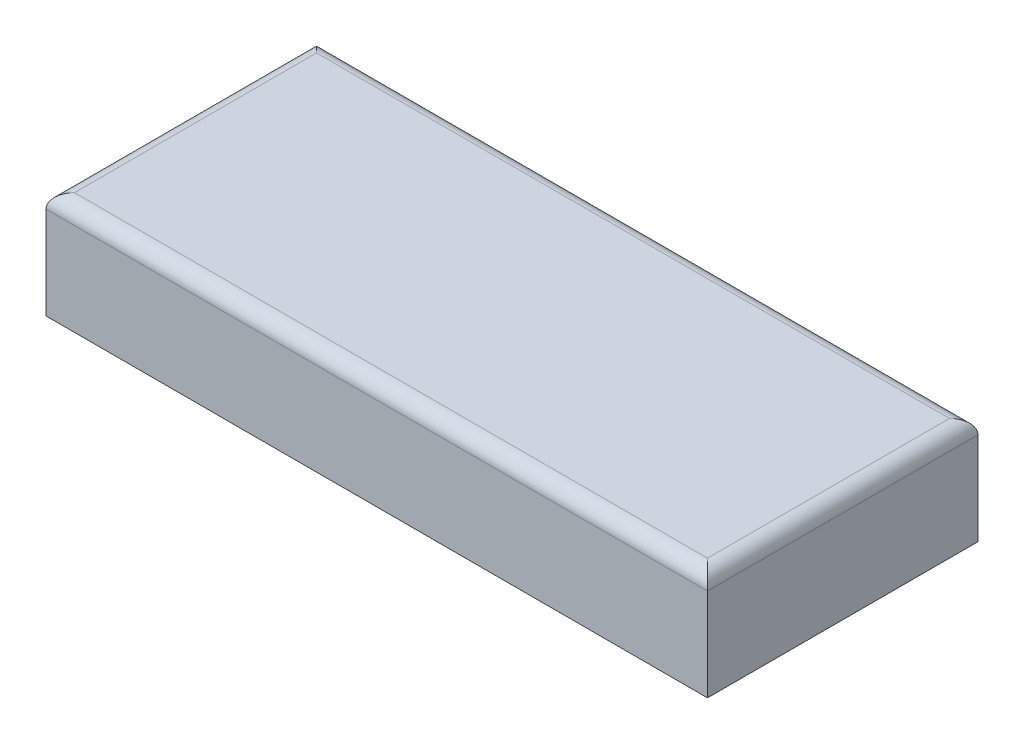
ISO-10303-21;
HEADER;
FILE_DESCRIPTION(('STEP AP214'),'2;1');
FILE_NAME('part.step','',(''),(''),'','','');
FILE_SCHEMA(('AUTOMOTIVE_DESIGN { 1 0 10303 214 1 1 1 1 }'));
ENDSEC;
DATA;
#1=APPLICATION_CONTEXT('core data for automotive mechanical design processes');
#2=APPLICATION_PROTOCOL_DEFINITION('international standard','automotive_design',2000,#1);
#3=PRODUCT_CONTEXT('',#1,'mechanical');
#4=PRODUCT('Part','Part','',(#3));
#5=PRODUCT_RELATED_PRODUCT_CATEGORY('part','',(#4));
#6=PRODUCT_DEFINITION_FORMATION('','',#4);
#7=PRODUCT_DEFINITION_CONTEXT('part definition',#1,'design');
#8=PRODUCT_DEFINITION('design','',#6,#7);
#9=PRODUCT_DEFINITION_SHAPE('','',#8);
#10=(LENGTH_UNIT() NAMED_UNIT(*) SI_UNIT(.MILLI.,.METRE.));
#11=(NAMED_UNIT(*) PLANE_ANGLE_UNIT() SI_UNIT($,.RADIAN.));
#12=(NAMED_UNIT(*) SI_UNIT($,.STERADIAN.) SOLID_ANGLE_UNIT());
#13=UNCERTAINTY_MEASURE_WITH_UNIT(LENGTH_MEASURE(1.E-05),#10,'distance_accuracy_value','');
#14=(GEOMETRIC_REPRESENTATION_CONTEXT(3) GLOBAL_UNCERTAINTY_ASSIGNED_CONTEXT((#13)) GLOBAL_UNIT_ASSIGNED_CONTEXT((#10,
#11,#12)) REPRESENTATION_CONTEXT('',''));
#15=CARTESIAN_POINT('',(0.,0.,0.));
#16=DIRECTION('',(0.,0.,1.));
#17=DIRECTION('',(1.,0.,0.));
#18=AXIS2_PLACEMENT_3D('',#15,#16,#17);
#19=CARTESIAN_POINT('',(0.,6.35000000000003,48.26));
#20=DIRECTION('',(0.,1.,0.));
#21=DIRECTION('',(-1.,0.,0.));
#22=AXIS2_PLACEMENT_3D('',#19,#20,#21);
#23=PLANE('',#22);
#24=DIRECTION('',(1.,0.,0.));
#25=VECTOR('',#24,1.);
#26=CARTESIAN_POINT('',(1.8766422945239,6.35000000000003,2.3850756876392));
#27=LINE('',#26,#25);
#28=CARTESIAN_POINT('',(1.8766422945239,6.35000000000003,2.3850756876392));
#29=VERTEX_POINT('',#28);
#30=CARTESIAN_POINT('',(116.176642294524,6.35000000000005,2.38507568763921));
#31=VERTEX_POINT('',#30);
#32=EDGE_CURVE('E189',#29,#31,#27,.T.);
#33=ORIENTED_EDGE('',*,*,#32,.F.);
#34=DIRECTION('',(0.,0.,-1.));
#35=VECTOR('',#34,1.);
#36=CARTESIAN_POINT('',(1.8766422945239,6.35000000000003,45.5650756876392));
#37=LINE('',#36,#35);
#38=CARTESIAN_POINT('',(1.8766422945239,6.35000000000003,45.5650756876392));
#39=VERTEX_POINT('',#38);
#40=EDGE_CURVE('E171',#39,#29,#37,.T.);
#41=ORIENTED_EDGE('',*,*,#40,.F.);
#42=DIRECTION('',(-1.,0.,0.));
#43=VECTOR('',#42,1.);
#44=CARTESIAN_POINT('',(1.8766422945239,6.35000000000003,45.5650756876392));
#45=LINE('',#44,#43);
#46=CARTESIAN_POINT('',(116.176642294524,6.35000000000005,45.5650756876392));
#47=VERTEX_POINT('',#46);
#48=EDGE_CURVE('E178',#47,#39,#45,.T.);
#49=ORIENTED_EDGE('',*,*,#48,.F.);
#50=DIRECTION('',(0.,0.,1.));
#51=VECTOR('',#50,1.);
#52=CARTESIAN_POINT('',(116.176642294524,6.35000000000005,45.5650756876392));
#53=LINE('',#52,#51);
#54=EDGE_CURVE('E192',#31,#47,#53,.T.);
#55=ORIENTED_EDGE('',*,*,#54,.F.);
#56=EDGE_LOOP('',(#33,#41,#49,#55));
#57=FACE_BOUND('',#56,.T.);
#58=DIRECTION('',(1.,0.,0.));
#59=VECTOR('',#58,1.);
#60=CARTESIAN_POINT('',(0.,6.35000000000003,0.));
#61=LINE('',#60,#59);
#62=CARTESIAN_POINT('',(0.,6.35000000000003,0.));
#63=VERTEX_POINT('',#62);
#64=CARTESIAN_POINT('',(118.023469291308,6.35000000000005,0.));
#65=VERTEX_POINT('',#64);
#66=EDGE_CURVE('E199',#63,#65,#61,.T.);
#67=ORIENTED_EDGE('',*,*,#66,.T.);
#68=DIRECTION('',(0.,0.,-1.));
#69=VECTOR('',#68,1.);
#70=CARTESIAN_POINT('',(118.023469291308,6.35000000000005,48.26));
#71=LINE('',#70,#69);
#72=CARTESIAN_POINT('',(118.023469291308,6.35000000000005,48.26));
#73=VERTEX_POINT('',#72);
#74=EDGE_CURVE('E221',#73,#65,#71,.T.);
#75=ORIENTED_EDGE('',*,*,#74,.F.);
#76=DIRECTION('',(1.,0.,0.));
#77=VECTOR('',#76,1.);
#78=CARTESIAN_POINT('',(0.,6.35000000000003,48.26));
#79=LINE('',#78,#77);
#80=CARTESIAN_POINT('',(0.,6.35000000000003,48.26));
#81=VERTEX_POINT('',#80);
#82=EDGE_CURVE('E206',#81,#73,#79,.T.);
#83=ORIENTED_EDGE('',*,*,#82,.F.);
#84=DIRECTION('',(0.,0.,-1.));
#85=VECTOR('',#84,1.);
#86=CARTESIAN_POINT('',(0.,6.35000000000003,48.26));
#87=LINE('',#86,#85);
#88=EDGE_CURVE('E214',#81,#63,#87,.T.);
#89=ORIENTED_EDGE('',*,*,#88,.T.);
#90=EDGE_LOOP('',(#67,#75,#83,#89));
#91=FACE_BOUND('',#90,.T.);
#92=ADVANCED_FACE('F35',(#57,#91),#23,.F.);
#93=CARTESIAN_POINT('',(118.023469291308,25.3999999999905,48.26));
#94=DIRECTION('',(1.,0.,0.));
#95=DIRECTION('',(0.,1.,0.));
#96=AXIS2_PLACEMENT_3D('',#93,#94,#95);
#97=PLANE('',#96);
#98=DIRECTION('',(0.,-1.,0.));
#99=VECTOR('',#98,1.);
#100=CARTESIAN_POINT('',(118.023469291308,25.3999999999905,0.));
#101=LINE('',#100,#99);
#102=CARTESIAN_POINT('',(118.023469291308,22.8599999999905,0.));
#103=VERTEX_POINT('',#102);
#104=EDGE_CURVE('E217',#103,#65,#101,.T.);
#105=ORIENTED_EDGE('',*,*,#104,.F.);
#106=DIRECTION('',(0.,0.,-1.));
#107=VECTOR('',#106,1.);
#108=CARTESIAN_POINT('',(118.023469291308,22.8599999999905,48.26));
#109=LINE('',#108,#107);
#110=CARTESIAN_POINT('',(118.023469291308,22.8599999999905,48.26));
#111=VERTEX_POINT('',#110);
#112=EDGE_CURVE('E242',#103,#111,#109,.F.);
#113=ORIENTED_EDGE('',*,*,#112,.T.);
#114=DIRECTION('',(0.,-1.,0.));
#115=VECTOR('',#114,1.);
#116=CARTESIAN_POINT('',(118.023469291308,25.3999999999905,48.26));
#117=LINE('',#116,#115);
#118=EDGE_CURVE('E209',#111,#73,#117,.T.);
#119=ORIENTED_EDGE('',*,*,#118,.T.);
#120=ORIENTED_EDGE('',*,*,#74,.T.);
#121=EDGE_LOOP('',(#105,#113,#119,#120));
#122=FACE_BOUND('',#121,.T.);
#123=ADVANCED_FACE('F297',(#122),#97,.T.);
#124=CARTESIAN_POINT('',(0.,25.3999999999905,48.26));
#125=DIRECTION('',(0.,1.,0.));
#126=DIRECTION('',(-1.,0.,0.));
#127=AXIS2_PLACEMENT_3D('',#124,#125,#126);
#128=PLANE('',#127);
#129=DIRECTION('',(1.,0.,0.));
#130=VECTOR('',#129,1.);
#131=CARTESIAN_POINT('',(118.023469291308,25.3999999999905,45.72));
#132=LINE('',#131,#130);
#133=CARTESIAN_POINT('',(2.54,25.3999999999905,45.72));
#134=VERTEX_POINT('',#133);
#135=CARTESIAN_POINT('',(115.483469291308,25.3999999999905,45.72));
#136=VERTEX_POINT('',#135);
#137=EDGE_CURVE('E237',#134,#136,#132,.T.);
#138=ORIENTED_EDGE('',*,*,#137,.T.);
#139=DIRECTION('',(0.,0.,-1.));
#140=VECTOR('',#139,1.);
#141=CARTESIAN_POINT('',(115.483469291308,25.3999999999905,48.26));
#142=LINE('',#141,#140);
#143=CARTESIAN_POINT('',(115.483469291308,25.3999999999905,2.54));
#144=VERTEX_POINT('',#143);
#145=EDGE_CURVE('E239',#136,#144,#142,.T.);
#146=ORIENTED_EDGE('',*,*,#145,.T.);
#147=DIRECTION('',(1.,0.,0.));
#148=VECTOR('',#147,1.);
#149=CARTESIAN_POINT('',(0.,25.3999999999905,2.54));
#150=LINE('',#149,#148);
#151=CARTESIAN_POINT('',(2.54,25.3999999999905,2.54));
#152=VERTEX_POINT('',#151);
#153=EDGE_CURVE('E233',#144,#152,#150,.F.);
#154=ORIENTED_EDGE('',*,*,#153,.T.);
#155=DIRECTION('',(0.,0.,-1.));
#156=VECTOR('',#155,1.);
#157=CARTESIAN_POINT('',(2.54,25.3999999999905,48.26));
#158=LINE('',#157,#156);
#159=EDGE_CURVE('E235',#152,#134,#158,.F.);
#160=ORIENTED_EDGE('',*,*,#159,.T.);
#161=EDGE_LOOP('',(#138,#146,#154,#160));
#162=FACE_BOUND('',#161,.T.);
#163=ADVANCED_FACE('F302',(#162),#128,.T.);
#164=CARTESIAN_POINT('',(0.,6.35000000000003,48.26));
#165=DIRECTION('',(-1.,0.,0.));
#166=DIRECTION('',(0.,-1.,0.));
#167=AXIS2_PLACEMENT_3D('',#164,#165,#166);
#168=PLANE('',#167);
#169=DIRECTION('',(0.,-1.,0.));
#170=VECTOR('',#169,1.);
#171=CARTESIAN_POINT('',(0.,19.038147592029,17.7550505806973));
#172=LINE('',#171,#170);
#173=CARTESIAN_POINT('',(0.,19.038147592029,17.7550505806973));
#174=VERTEX_POINT('',#173);
#175=CARTESIAN_POINT('',(0.,12.688147592029,17.7550505806973));
#176=VERTEX_POINT('',#175);
#177=EDGE_CURVE('E160',#174,#176,#172,.T.);
#178=ORIENTED_EDGE('',*,*,#177,.F.);
#179=DIRECTION('',(0.,0.,-1.));
#180=VECTOR('',#179,1.);
#181=CARTESIAN_POINT('',(0.,19.038147592029,17.7550505806973));
#182=LINE('',#181,#180);
#183=CARTESIAN_POINT('',(0.,19.038147592029,30.4550505806972));
#184=VERTEX_POINT('',#183);
#185=EDGE_CURVE('E164',#184,#174,#182,.T.);
#186=ORIENTED_EDGE('',*,*,#185,.F.);
#187=DIRECTION('',(0.,1.,0.));
#188=VECTOR('',#187,1.);
#189=CARTESIAN_POINT('',(0.,19.038147592029,30.4550505806972));
#190=LINE('',#189,#188);
#191=CARTESIAN_POINT('',(0.,12.688147592029,30.4550505806972));
#192=VERTEX_POINT('',#191);
#193=EDGE_CURVE('E144',#192,#184,#190,.T.);
#194=ORIENTED_EDGE('',*,*,#193,.F.);
#195=DIRECTION('',(0.,0.,1.));
#196=VECTOR('',#195,1.);
#197=CARTESIAN_POINT('',(0.,12.688147592029,17.7550505806973));
#198=LINE('',#197,#196);
#199=EDGE_CURVE('E155',#176,#192,#198,.T.);
#200=ORIENTED_EDGE('',*,*,#199,.F.);
#201=EDGE_LOOP('',(#178,#186,#194,#200));
#202=FACE_BOUND('',#201,.T.);
#203=DIRECTION('',(0.,1.,0.));
#204=VECTOR('',#203,1.);
#205=CARTESIAN_POINT('',(0.,6.35000000000003,48.26));
#206=LINE('',#205,#204);
#207=CARTESIAN_POINT('',(0.,22.8599999999905,48.26));
#208=VERTEX_POINT('',#207);
#209=EDGE_CURVE('E212',#81,#208,#206,.T.);
#210=ORIENTED_EDGE('',*,*,#209,.T.);
#211=DIRECTION('',(0.,0.,-1.));
#212=VECTOR('',#211,1.);
#213=CARTESIAN_POINT('',(0.,22.8599999999905,48.26));
#214=LINE('',#213,#212);
#215=CARTESIAN_POINT('',(0.,22.8599999999905,0.));
#216=VERTEX_POINT('',#215);
#217=EDGE_CURVE('E44',#208,#216,#214,.T.);
#218=ORIENTED_EDGE('',*,*,#217,.T.);
#219=DIRECTION('',(0.,1.,0.));
#220=VECTOR('',#219,1.);
#221=CARTESIAN_POINT('',(0.,6.35000000000003,0.));
#222=LINE('',#221,#220);
#223=EDGE_CURVE('E210',#63,#216,#222,.T.);
#224=ORIENTED_EDGE('',*,*,#223,.F.);
#225=ORIENTED_EDGE('',*,*,#88,.F.);
#226=EDGE_LOOP('',(#210,#218,#224,#225));
#227=FACE_BOUND('',#226,.T.);
#228=ADVANCED_FACE('F162',(#202,#227),#168,.T.);
#229=CARTESIAN_POINT('',(0.,0.,48.26));
#230=DIRECTION('',(0.,0.,-1.));
#231=DIRECTION('',(-1.,0.,0.));
#232=AXIS2_PLACEMENT_3D('',#229,#230,#231);
#233=PLANE('',#232);
#234=ORIENTED_EDGE('',*,*,#118,.F.);
#235=DIRECTION('',(1.,0.,0.));
#236=VECTOR('',#235,1.);
#237=CARTESIAN_POINT('',(0.,22.8599999999905,48.26));
#238=LINE('',#237,#236);
#239=EDGE_CURVE('E59',#111,#208,#238,.F.);
#240=ORIENTED_EDGE('',*,*,#239,.T.);
#241=ORIENTED_EDGE('',*,*,#209,.F.);
#242=ORIENTED_EDGE('',*,*,#82,.T.);
#243=EDGE_LOOP('',(#234,#240,#241,#242));
#244=FACE_BOUND('',#243,.T.);
#245=ADVANCED_FACE('F337',(#244),#233,.F.);
#246=CARTESIAN_POINT('',(0.,0.,0.));
#247=DIRECTION('',(0.,0.,-1.));
#248=DIRECTION('',(-1.,0.,0.));
#249=AXIS2_PLACEMENT_3D('',#246,#247,#248);
#250=PLANE('',#249);
#251=ORIENTED_EDGE('',*,*,#223,.T.);
#252=DIRECTION('',(1.,0.,0.));
#253=VECTOR('',#252,1.);
#254=CARTESIAN_POINT('',(0.,22.8599999999905,0.));
#255=LINE('',#254,#253);
#256=EDGE_CURVE('E11',#216,#103,#255,.T.);
#257=ORIENTED_EDGE('',*,*,#256,.T.);
#258=ORIENTED_EDGE('',*,*,#104,.T.);
#259=ORIENTED_EDGE('',*,*,#66,.F.);
#260=EDGE_LOOP('',(#251,#257,#258,#259));
#261=FACE_BOUND('',#260,.T.);
#262=ADVANCED_FACE('F270',(#261),#250,.T.);
#263=CARTESIAN_POINT('',(1.8766422945239,24.13,45.5650756876392));
#264=DIRECTION('',(-1.,0.,0.));
#265=DIRECTION('',(0.,-1.,0.));
#266=AXIS2_PLACEMENT_3D('',#263,#264,#265);
#267=PLANE('',#266);
#268=DIRECTION('',(0.,0.,-1.));
#269=VECTOR('',#268,1.);
#270=CARTESIAN_POINT('',(1.8766422945239,19.038147592029,45.5650756876392));
#271=LINE('',#270,#269);
#272=CARTESIAN_POINT('',(1.8766422945239,19.038147592029,30.4550505806972));
#273=VERTEX_POINT('',#272);
#274=CARTESIAN_POINT('',(1.8766422945239,19.038147592029,17.7550505806973));
#275=VERTEX_POINT('',#274);
#276=EDGE_CURVE('E227',#273,#275,#271,.T.);
#277=ORIENTED_EDGE('',*,*,#276,.T.);
#278=DIRECTION('',(0.,-1.,0.));
#279=VECTOR('',#278,1.);
#280=CARTESIAN_POINT('',(1.8766422945239,24.13,17.7550505806973));
#281=LINE('',#280,#279);
#282=CARTESIAN_POINT('',(1.8766422945239,12.688147592029,17.7550505806973));
#283=VERTEX_POINT('',#282);
#284=EDGE_CURVE('E230',#275,#283,#281,.T.);
#285=ORIENTED_EDGE('',*,*,#284,.T.);
#286=DIRECTION('',(0.,0.,1.));
#287=VECTOR('',#286,1.);
#288=CARTESIAN_POINT('',(1.8766422945239,12.688147592029,45.5650756876392));
#289=LINE('',#288,#287);
#290=CARTESIAN_POINT('',(1.8766422945239,12.688147592029,30.4550505806972));
#291=VERTEX_POINT('',#290);
#292=EDGE_CURVE('E224',#283,#291,#289,.T.);
#293=ORIENTED_EDGE('',*,*,#292,.T.);
#294=DIRECTION('',(0.,1.,0.));
#295=VECTOR('',#294,1.);
#296=CARTESIAN_POINT('',(1.8766422945239,24.13,30.4550505806972));
#297=LINE('',#296,#295);
#298=EDGE_CURVE('E147',#291,#273,#297,.T.);
#299=ORIENTED_EDGE('',*,*,#298,.T.);
#300=EDGE_LOOP('',(#277,#285,#293,#299));
#301=FACE_BOUND('',#300,.T.);
#302=ORIENTED_EDGE('',*,*,#40,.T.);
#303=DIRECTION('',(0.,-1.,0.));
#304=VECTOR('',#303,1.);
#305=CARTESIAN_POINT('',(1.8766422945239,24.13,2.3850756876392));
#306=LINE('',#305,#304);
#307=CARTESIAN_POINT('',(1.8766422945239,24.13,2.3850756876392));
#308=VERTEX_POINT('',#307);
#309=EDGE_CURVE('E187',#308,#29,#306,.T.);
#310=ORIENTED_EDGE('',*,*,#309,.F.);
#311=DIRECTION('',(0.,0.,-1.));
#312=VECTOR('',#311,1.);
#313=CARTESIAN_POINT('',(1.8766422945239,24.13,45.5650756876392));
#314=LINE('',#313,#312);
#315=CARTESIAN_POINT('',(1.8766422945239,24.13,45.5650756876392));
#316=VERTEX_POINT('',#315);
#317=EDGE_CURVE('E174',#316,#308,#314,.T.);
#318=ORIENTED_EDGE('',*,*,#317,.F.);
#319=DIRECTION('',(0.,-1.,0.));
#320=VECTOR('',#319,1.);
#321=CARTESIAN_POINT('',(1.8766422945239,24.13,45.5650756876392));
#322=LINE('',#321,#320);
#323=EDGE_CURVE('E197',#316,#39,#322,.T.);
#324=ORIENTED_EDGE('',*,*,#323,.T.);
#325=EDGE_LOOP('',(#302,#310,#318,#324));
#326=FACE_BOUND('',#325,.T.);
#327=ADVANCED_FACE('F266',(#301,#326),#267,.F.);
#328=CARTESIAN_POINT('',(1.8766422945239,24.13,45.5650756876392));
#329=DIRECTION('',(0.,0.,1.));
#330=DIRECTION('',(1.,0.,0.));
#331=AXIS2_PLACEMENT_3D('',#328,#329,#330);
#332=PLANE('',#331);
#333=ORIENTED_EDGE('',*,*,#48,.T.);
#334=ORIENTED_EDGE('',*,*,#323,.F.);
#335=DIRECTION('',(-1.,0.,0.));
#336=VECTOR('',#335,1.);
#337=CARTESIAN_POINT('',(1.8766422945239,24.13,45.5650756876392));
#338=LINE('',#337,#336);
#339=CARTESIAN_POINT('',(116.176642294524,24.13,45.5650756876392));
#340=VERTEX_POINT('',#339);
#341=EDGE_CURVE('E184',#340,#316,#338,.T.);
#342=ORIENTED_EDGE('',*,*,#341,.F.);
#343=DIRECTION('',(0.,-1.,0.));
#344=VECTOR('',#343,1.);
#345=CARTESIAN_POINT('',(116.176642294524,24.13,45.5650756876392));
#346=LINE('',#345,#344);
#347=EDGE_CURVE('E200',#340,#47,#346,.T.);
#348=ORIENTED_EDGE('',*,*,#347,.T.);
#349=EDGE_LOOP('',(#333,#334,#342,#348));
#350=FACE_BOUND('',#349,.T.);
#351=ADVANCED_FACE('F269',(#350),#332,.F.);
#352=CARTESIAN_POINT('',(116.176642294524,24.13,45.5650756876392));
#353=DIRECTION('',(1.,0.,0.));
#354=DIRECTION('',(0.,1.,0.));
#355=AXIS2_PLACEMENT_3D('',#352,#353,#354);
#356=PLANE('',#355);
#357=ORIENTED_EDGE('',*,*,#54,.T.);
#358=ORIENTED_EDGE('',*,*,#347,.F.);
#359=DIRECTION('',(0.,0.,1.));
#360=VECTOR('',#359,1.);
#361=CARTESIAN_POINT('',(116.176642294524,24.13,45.5650756876392));
#362=LINE('',#361,#360);
#363=CARTESIAN_POINT('',(116.176642294524,24.13,2.38507568763921));
#364=VERTEX_POINT('',#363);
#365=EDGE_CURVE('E181',#364,#340,#362,.T.);
#366=ORIENTED_EDGE('',*,*,#365,.F.);
#367=DIRECTION('',(0.,-1.,0.));
#368=VECTOR('',#367,1.);
#369=CARTESIAN_POINT('',(116.176642294524,24.13,2.38507568763921));
#370=LINE('',#369,#368);
#371=EDGE_CURVE('E202',#364,#31,#370,.T.);
#372=ORIENTED_EDGE('',*,*,#371,.T.);
#373=EDGE_LOOP('',(#357,#358,#366,#372));
#374=FACE_BOUND('',#373,.T.);
#375=ADVANCED_FACE('F283',(#374),#356,.F.);
#376=CARTESIAN_POINT('',(1.8766422945239,24.13,2.3850756876392));
#377=DIRECTION('',(0.,0.,-1.));
#378=DIRECTION('',(-1.,0.,0.));
#379=AXIS2_PLACEMENT_3D('',#376,#377,#378);
#380=PLANE('',#379);
#381=ORIENTED_EDGE('',*,*,#32,.T.);
#382=ORIENTED_EDGE('',*,*,#371,.F.);
#383=DIRECTION('',(1.,0.,0.));
#384=VECTOR('',#383,1.);
#385=CARTESIAN_POINT('',(1.8766422945239,24.13,2.3850756876392));
#386=LINE('',#385,#384);
#387=EDGE_CURVE('E177',#308,#364,#386,.T.);
#388=ORIENTED_EDGE('',*,*,#387,.F.);
#389=ORIENTED_EDGE('',*,*,#309,.T.);
#390=EDGE_LOOP('',(#381,#382,#388,#389));
#391=FACE_BOUND('',#390,.T.);
#392=ADVANCED_FACE('F279',(#391),#380,.F.);
#393=CARTESIAN_POINT('',(0.,24.13,0.));
#394=DIRECTION('',(0.,-1.,0.));
#395=DIRECTION('',(1.,0.,0.));
#396=AXIS2_PLACEMENT_3D('',#393,#394,#395);
#397=PLANE('',#396);
#398=ORIENTED_EDGE('',*,*,#317,.T.);
#399=ORIENTED_EDGE('',*,*,#387,.T.);
#400=ORIENTED_EDGE('',*,*,#365,.T.);
#401=ORIENTED_EDGE('',*,*,#341,.T.);
#402=EDGE_LOOP('',(#398,#399,#400,#401));
#403=FACE_BOUND('',#402,.T.);
#404=ADVANCED_FACE('F287',(#403),#397,.T.);
#405=CARTESIAN_POINT('',(6.60399999999999,19.038147592029,17.7550505806973));
#406=DIRECTION('',(0.,0.,-1.));
#407=DIRECTION('',(-1.,0.,0.));
#408=AXIS2_PLACEMENT_3D('',#405,#406,#407);
#409=PLANE('',#408);
#410=DIRECTION('',(-1.,0.,0.));
#411=VECTOR('',#410,1.);
#412=CARTESIAN_POINT('',(6.60399999999999,19.038147592029,17.7550505806973));
#413=LINE('',#412,#411);
#414=EDGE_CURVE('E169',#275,#174,#413,.T.);
#415=ORIENTED_EDGE('',*,*,#414,.T.);
#416=ORIENTED_EDGE('',*,*,#177,.T.);
#417=DIRECTION('',(-1.,0.,0.));
#418=VECTOR('',#417,1.);
#419=CARTESIAN_POINT('',(6.604,12.688147592029,17.7550505806973));
#420=LINE('',#419,#418);
#421=EDGE_CURVE('E151',#283,#176,#420,.T.);
#422=ORIENTED_EDGE('',*,*,#421,.F.);
#423=ORIENTED_EDGE('',*,*,#284,.F.);
#424=EDGE_LOOP('',(#415,#416,#422,#423));
#425=FACE_BOUND('',#424,.T.);
#426=ADVANCED_FACE('F261',(#425),#409,.F.);
#427=CARTESIAN_POINT('',(6.60399999999999,19.038147592029,17.7550505806973));
#428=DIRECTION('',(0.,1.,0.));
#429=DIRECTION('',(-1.,0.,0.));
#430=AXIS2_PLACEMENT_3D('',#427,#428,#429);
#431=PLANE('',#430);
#432=DIRECTION('',(-1.,0.,0.));
#433=VECTOR('',#432,1.);
#434=CARTESIAN_POINT('',(6.60399999999999,19.038147592029,30.4550505806972));
#435=LINE('',#434,#433);
#436=EDGE_CURVE('E150',#273,#184,#435,.T.);
#437=ORIENTED_EDGE('',*,*,#436,.T.);
#438=ORIENTED_EDGE('',*,*,#185,.T.);
#439=ORIENTED_EDGE('',*,*,#414,.F.);
#440=ORIENTED_EDGE('',*,*,#276,.F.);
#441=EDGE_LOOP('',(#437,#438,#439,#440));
#442=FACE_BOUND('',#441,.T.);
#443=ADVANCED_FACE('F264',(#442),#431,.F.);
#444=CARTESIAN_POINT('',(6.60399999999999,19.038147592029,30.4550505806972));
#445=DIRECTION('',(0.,0.,1.));
#446=DIRECTION('',(1.,0.,0.));
#447=AXIS2_PLACEMENT_3D('',#444,#445,#446);
#448=PLANE('',#447);
#449=DIRECTION('',(-1.,0.,0.));
#450=VECTOR('',#449,1.);
#451=CARTESIAN_POINT('',(6.604,12.688147592029,30.4550505806972));
#452=LINE('',#451,#450);
#453=EDGE_CURVE('E139',#291,#192,#452,.T.);
#454=ORIENTED_EDGE('',*,*,#453,.T.);
#455=ORIENTED_EDGE('',*,*,#193,.T.);
#456=ORIENTED_EDGE('',*,*,#436,.F.);
#457=ORIENTED_EDGE('',*,*,#298,.F.);
#458=EDGE_LOOP('',(#454,#455,#456,#457));
#459=FACE_BOUND('',#458,.T.);
#460=ADVANCED_FACE('F141',(#459),#448,.F.);
#461=CARTESIAN_POINT('',(6.604,12.688147592029,17.7550505806973));
#462=DIRECTION('',(0.,-1.,0.));
#463=DIRECTION('',(1.,0.,0.));
#464=AXIS2_PLACEMENT_3D('',#461,#462,#463);
#465=PLANE('',#464);
#466=ORIENTED_EDGE('',*,*,#421,.T.);
#467=ORIENTED_EDGE('',*,*,#199,.T.);
#468=ORIENTED_EDGE('',*,*,#453,.F.);
#469=ORIENTED_EDGE('',*,*,#292,.F.);
#470=EDGE_LOOP('',(#466,#467,#468,#469));
#471=FACE_BOUND('',#470,.T.);
#472=ADVANCED_FACE('F156',(#471),#465,.F.);
#473=CARTESIAN_POINT('',(2.54,22.8599999999905,48.26));
#474=DIRECTION('',(0.,0.,-1.));
#475=DIRECTION('',(-1.,0.,0.));
#476=AXIS2_PLACEMENT_3D('',#473,#474,#475);
#477=CYLINDRICAL_SURFACE('',#476,2.54);
#478=CARTESIAN_POINT('',(2.54,22.8599999999905,2.54));
#479=DIRECTION('',(0.707106781186547,0.,-0.707106781186547));
#480=DIRECTION('',(0.707106781186547,0.,0.707106781186547));
#481=AXIS2_PLACEMENT_3D('',#478,#479,#480);
#482=ELLIPSE('',#481,3.59210244842766,2.54);
#483=EDGE_CURVE('E250',#216,#152,#482,.T.);
#484=ORIENTED_EDGE('',*,*,#483,.F.);
#485=ORIENTED_EDGE('',*,*,#217,.F.);
#486=CARTESIAN_POINT('',(2.54,22.8599999999905,45.72));
#487=DIRECTION('',(-0.707106781186547,0.,-0.707106781186547));
#488=DIRECTION('',(0.707106781186547,0.,-0.707106781186547));
#489=AXIS2_PLACEMENT_3D('',#486,#487,#488);
#490=ELLIPSE('',#489,3.59210244842766,2.54);
#491=EDGE_CURVE('E39',#134,#208,#490,.F.);
#492=ORIENTED_EDGE('',*,*,#491,.F.);
#493=ORIENTED_EDGE('',*,*,#159,.F.);
#494=EDGE_LOOP('',(#484,#485,#492,#493));
#495=FACE_BOUND('',#494,.T.);
#496=ADVANCED_FACE('F37',(#495),#477,.T.);
#497=CARTESIAN_POINT('',(0.,22.8599999999905,45.72));
#498=DIRECTION('',(-1.,0.,0.));
#499=DIRECTION('',(0.,-1.,0.));
#500=AXIS2_PLACEMENT_3D('',#497,#498,#499);
#501=CYLINDRICAL_SURFACE('',#500,2.54);
#502=ORIENTED_EDGE('',*,*,#491,.T.);
#503=ORIENTED_EDGE('',*,*,#239,.F.);
#504=CARTESIAN_POINT('',(115.483469291308,22.8599999999905,45.72));
#505=DIRECTION('',(-0.707106781186547,0.,0.707106781186547));
#506=DIRECTION('',(-0.707106781186547,0.,-0.707106781186547));
#507=AXIS2_PLACEMENT_3D('',#504,#505,#506);
#508=ELLIPSE('',#507,3.59210244842766,2.54);
#509=EDGE_CURVE('E249',#136,#111,#508,.F.);
#510=ORIENTED_EDGE('',*,*,#509,.F.);
#511=ORIENTED_EDGE('',*,*,#137,.F.);
#512=EDGE_LOOP('',(#502,#503,#510,#511));
#513=FACE_BOUND('',#512,.T.);
#514=ADVANCED_FACE('F313',(#513),#501,.T.);
#515=CARTESIAN_POINT('',(0.,22.8599999999905,2.54));
#516=DIRECTION('',(1.,0.,0.));
#517=DIRECTION('',(0.,1.,0.));
#518=AXIS2_PLACEMENT_3D('',#515,#516,#517);
#519=CYLINDRICAL_SURFACE('',#518,2.54);
#520=ORIENTED_EDGE('',*,*,#483,.T.);
#521=ORIENTED_EDGE('',*,*,#153,.F.);
#522=CARTESIAN_POINT('',(115.483469291308,22.8599999999905,2.54));
#523=DIRECTION('',(0.707106781186547,0.,0.707106781186547));
#524=DIRECTION('',(0.707106781186547,0.,-0.707106781186547));
#525=AXIS2_PLACEMENT_3D('',#522,#523,#524);
#526=ELLIPSE('',#525,3.59210244842766,2.54);
#527=EDGE_CURVE('E247',#103,#144,#526,.T.);
#528=ORIENTED_EDGE('',*,*,#527,.F.);
#529=ORIENTED_EDGE('',*,*,#256,.F.);
#530=EDGE_LOOP('',(#520,#521,#528,#529));
#531=FACE_BOUND('',#530,.T.);
#532=ADVANCED_FACE('F310',(#531),#519,.T.);
#533=CARTESIAN_POINT('',(115.483469291308,22.8599999999905,48.26));
#534=DIRECTION('',(0.,0.,-1.));
#535=DIRECTION('',(-1.,0.,0.));
#536=AXIS2_PLACEMENT_3D('',#533,#534,#535);
#537=CYLINDRICAL_SURFACE('',#536,2.54);
#538=ORIENTED_EDGE('',*,*,#509,.T.);
#539=ORIENTED_EDGE('',*,*,#112,.F.);
#540=ORIENTED_EDGE('',*,*,#527,.T.);
#541=ORIENTED_EDGE('',*,*,#145,.F.);
#542=EDGE_LOOP('',(#538,#539,#540,#541));
#543=FACE_BOUND('',#542,.T.);
#544=ADVANCED_FACE('F307',(#543),#537,.T.);
#545=CLOSED_SHELL('',(#92,#123,#163,#228,#245,#262,#327,#351,#375,#392,#404,#426,#443,#460,#472,
#496,#514,#532,#544));
#546=MANIFOLD_SOLID_BREP('B2',#545);
#547=ADVANCED_BREP_SHAPE_REPRESENTATION('',(#18,#546),#14);
#548=SHAPE_DEFINITION_REPRESENTATION(#9,#547);
ENDSEC;
END-ISO-10303-21;
